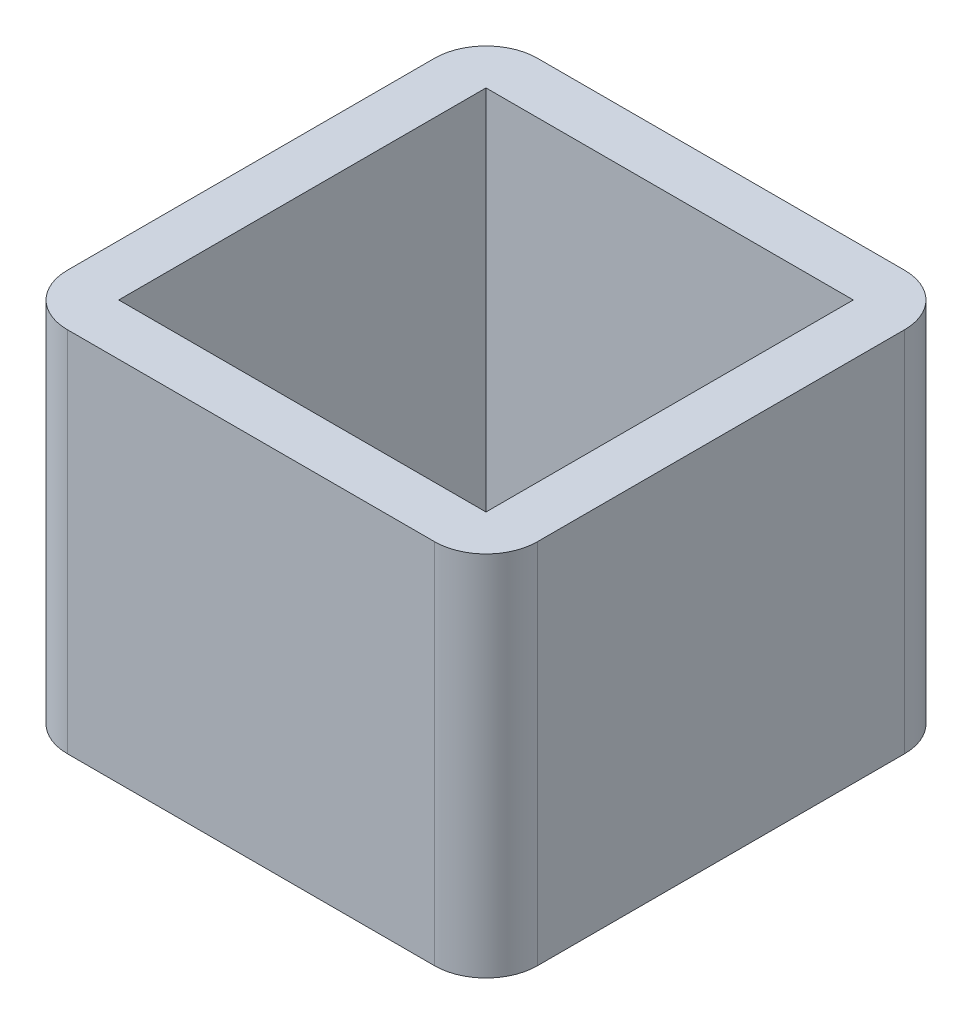
ISO-10303-21;
HEADER;
FILE_DESCRIPTION(('STEP AP214'),'2;1');
FILE_NAME('part.step','',(''),(''),'','','');
FILE_SCHEMA(('AUTOMOTIVE_DESIGN { 1 0 10303 214 1 1 1 1 }'));
ENDSEC;
DATA;
#1=APPLICATION_CONTEXT('core data for automotive mechanical design processes');
#2=APPLICATION_PROTOCOL_DEFINITION('international standard','automotive_design',2000,#1);
#3=PRODUCT_CONTEXT('',#1,'mechanical');
#4=PRODUCT('Part','Part','',(#3));
#5=PRODUCT_RELATED_PRODUCT_CATEGORY('part','',(#4));
#6=PRODUCT_DEFINITION_FORMATION('','',#4);
#7=PRODUCT_DEFINITION_CONTEXT('part definition',#1,'design');
#8=PRODUCT_DEFINITION('design','',#6,#7);
#9=PRODUCT_DEFINITION_SHAPE('','',#8);
#10=(LENGTH_UNIT() NAMED_UNIT(*) SI_UNIT(.MILLI.,.METRE.));
#11=(NAMED_UNIT(*) PLANE_ANGLE_UNIT() SI_UNIT($,.RADIAN.));
#12=(NAMED_UNIT(*) SI_UNIT($,.STERADIAN.) SOLID_ANGLE_UNIT());
#13=UNCERTAINTY_MEASURE_WITH_UNIT(LENGTH_MEASURE(1.E-05),#10,'distance_accuracy_value','');
#14=(GEOMETRIC_REPRESENTATION_CONTEXT(3) GLOBAL_UNCERTAINTY_ASSIGNED_CONTEXT((#13)) GLOBAL_UNIT_ASSIGNED_CONTEXT((#10,
#11,#12)) REPRESENTATION_CONTEXT('',''));
#15=CARTESIAN_POINT('',(0.,0.,0.));
#16=DIRECTION('',(0.,0.,1.));
#17=DIRECTION('',(1.,0.,0.));
#18=AXIS2_PLACEMENT_3D('',#15,#16,#17);
#19=CARTESIAN_POINT('',(22.8,20.,2.8));
#20=DIRECTION('',(0.,-1.,0.));
#21=DIRECTION('',(0.,0.,-1.));
#22=AXIS2_PLACEMENT_3D('',#19,#20,#21);
#23=CYLINDRICAL_SURFACE('',#22,2.8);
#24=CARTESIAN_POINT('',(22.8,0.,2.8));
#25=DIRECTION('',(0.,1.,0.));
#26=DIRECTION('',(0.,0.,-1.));
#27=AXIS2_PLACEMENT_3D('',#24,#25,#26);
#28=CIRCLE('',#27,2.8);
#29=CARTESIAN_POINT('',(25.6,0.,2.80000000000002));
#30=VERTEX_POINT('',#29);
#31=CARTESIAN_POINT('',(22.8,0.,0.));
#32=VERTEX_POINT('',#31);
#33=EDGE_CURVE('E157',#30,#32,#28,.T.);
#34=ORIENTED_EDGE('',*,*,#33,.T.);
#35=DIRECTION('',(0.,-1.,0.));
#36=VECTOR('',#35,1.);
#37=CARTESIAN_POINT('',(22.8,20.,0.));
#38=LINE('',#37,#36);
#39=CARTESIAN_POINT('',(22.8,20.,0.));
#40=VERTEX_POINT('',#39);
#41=EDGE_CURVE('E11',#40,#32,#38,.T.);
#42=ORIENTED_EDGE('',*,*,#41,.F.);
#43=CARTESIAN_POINT('',(22.8,20.,2.8));
#44=DIRECTION('',(0.,1.,0.));
#45=DIRECTION('',(0.,0.,-1.));
#46=AXIS2_PLACEMENT_3D('',#43,#44,#45);
#47=CIRCLE('',#46,2.8);
#48=CARTESIAN_POINT('',(25.6,20.,2.80000000000002));
#49=VERTEX_POINT('',#48);
#50=EDGE_CURVE('E158',#49,#40,#47,.T.);
#51=ORIENTED_EDGE('',*,*,#50,.F.);
#52=DIRECTION('',(0.,-1.,0.));
#53=VECTOR('',#52,1.);
#54=CARTESIAN_POINT('',(25.6,20.,2.80000000000002));
#55=LINE('',#54,#53);
#56=EDGE_CURVE('E176',#49,#30,#55,.T.);
#57=ORIENTED_EDGE('',*,*,#56,.T.);
#58=EDGE_LOOP('',(#34,#42,#51,#57));
#59=FACE_BOUND('',#58,.T.);
#60=ADVANCED_FACE('F32',(#59),#23,.T.);
#61=CARTESIAN_POINT('',(2.80000000000002,20.,0.));
#62=DIRECTION('',(0.,0.,1.));
#63=DIRECTION('',(1.,0.,0.));
#64=AXIS2_PLACEMENT_3D('',#61,#62,#63);
#65=PLANE('',#64);
#66=DIRECTION('',(-1.,0.,0.));
#67=VECTOR('',#66,1.);
#68=CARTESIAN_POINT('',(2.80000000000002,0.,0.));
#69=LINE('',#68,#67);
#70=CARTESIAN_POINT('',(2.80000000000002,0.,0.));
#71=VERTEX_POINT('',#70);
#72=EDGE_CURVE('E179',#32,#71,#69,.T.);
#73=ORIENTED_EDGE('',*,*,#72,.T.);
#74=DIRECTION('',(0.,-1.,0.));
#75=VECTOR('',#74,1.);
#76=CARTESIAN_POINT('',(2.80000000000002,20.,0.));
#77=LINE('',#76,#75);
#78=CARTESIAN_POINT('',(2.80000000000002,20.,0.));
#79=VERTEX_POINT('',#78);
#80=EDGE_CURVE('E39',#79,#71,#77,.T.);
#81=ORIENTED_EDGE('',*,*,#80,.F.);
#82=DIRECTION('',(-1.,0.,0.));
#83=VECTOR('',#82,1.);
#84=CARTESIAN_POINT('',(2.80000000000002,20.,0.));
#85=LINE('',#84,#83);
#86=EDGE_CURVE('E161',#40,#79,#85,.T.);
#87=ORIENTED_EDGE('',*,*,#86,.F.);
#88=ORIENTED_EDGE('',*,*,#41,.T.);
#89=EDGE_LOOP('',(#73,#81,#87,#88));
#90=FACE_BOUND('',#89,.T.);
#91=ADVANCED_FACE('F234',(#90),#65,.F.);
#92=CARTESIAN_POINT('',(2.8,20.,2.8));
#93=DIRECTION('',(0.,-1.,0.));
#94=DIRECTION('',(0.,0.,-1.));
#95=AXIS2_PLACEMENT_3D('',#92,#93,#94);
#96=CYLINDRICAL_SURFACE('',#95,2.8);
#97=CARTESIAN_POINT('',(2.8,0.,2.8));
#98=DIRECTION('',(0.,1.,0.));
#99=DIRECTION('',(0.,0.,1.));
#100=AXIS2_PLACEMENT_3D('',#97,#98,#99);
#101=CIRCLE('',#100,2.8);
#102=CARTESIAN_POINT('',(0.,0.,2.80000000000002));
#103=VERTEX_POINT('',#102);
#104=EDGE_CURVE('E181',#71,#103,#101,.T.);
#105=ORIENTED_EDGE('',*,*,#104,.T.);
#106=DIRECTION('',(0.,-1.,0.));
#107=VECTOR('',#106,1.);
#108=CARTESIAN_POINT('',(0.,20.,2.80000000000002));
#109=LINE('',#108,#107);
#110=CARTESIAN_POINT('',(0.,20.,2.80000000000002));
#111=VERTEX_POINT('',#110);
#112=EDGE_CURVE('E206',#111,#103,#109,.T.);
#113=ORIENTED_EDGE('',*,*,#112,.F.);
#114=CARTESIAN_POINT('',(2.8,20.,2.8));
#115=DIRECTION('',(0.,1.,0.));
#116=DIRECTION('',(0.,0.,1.));
#117=AXIS2_PLACEMENT_3D('',#114,#115,#116);
#118=CIRCLE('',#117,2.8);
#119=EDGE_CURVE('E164',#79,#111,#118,.T.);
#120=ORIENTED_EDGE('',*,*,#119,.F.);
#121=ORIENTED_EDGE('',*,*,#80,.T.);
#122=EDGE_LOOP('',(#105,#113,#120,#121));
#123=FACE_BOUND('',#122,.T.);
#124=ADVANCED_FACE('F213',(#123),#96,.T.);
#125=CARTESIAN_POINT('',(0.,20.,2.80000000000002));
#126=DIRECTION('',(1.,0.,0.));
#127=DIRECTION('',(0.,0.,-1.));
#128=AXIS2_PLACEMENT_3D('',#125,#126,#127);
#129=PLANE('',#128);
#130=DIRECTION('',(0.,0.,1.));
#131=VECTOR('',#130,1.);
#132=CARTESIAN_POINT('',(0.,0.,2.80000000000002));
#133=LINE('',#132,#131);
#134=CARTESIAN_POINT('',(0.,0.,22.8));
#135=VERTEX_POINT('',#134);
#136=EDGE_CURVE('E183',#103,#135,#133,.T.);
#137=ORIENTED_EDGE('',*,*,#136,.T.);
#138=DIRECTION('',(0.,-1.,0.));
#139=VECTOR('',#138,1.);
#140=CARTESIAN_POINT('',(0.,20.,22.8));
#141=LINE('',#140,#139);
#142=CARTESIAN_POINT('',(0.,20.,22.8));
#143=VERTEX_POINT('',#142);
#144=EDGE_CURVE('E203',#143,#135,#141,.T.);
#145=ORIENTED_EDGE('',*,*,#144,.F.);
#146=DIRECTION('',(0.,0.,1.));
#147=VECTOR('',#146,1.);
#148=CARTESIAN_POINT('',(0.,20.,2.80000000000002));
#149=LINE('',#148,#147);
#150=EDGE_CURVE('E166',#111,#143,#149,.T.);
#151=ORIENTED_EDGE('',*,*,#150,.F.);
#152=ORIENTED_EDGE('',*,*,#112,.T.);
#153=EDGE_LOOP('',(#137,#145,#151,#152));
#154=FACE_BOUND('',#153,.T.);
#155=ADVANCED_FACE('F222',(#154),#129,.F.);
#156=CARTESIAN_POINT('',(2.8,20.,22.8));
#157=DIRECTION('',(0.,-1.,0.));
#158=DIRECTION('',(0.,0.,-1.));
#159=AXIS2_PLACEMENT_3D('',#156,#157,#158);
#160=CYLINDRICAL_SURFACE('',#159,2.8);
#161=CARTESIAN_POINT('',(2.8,0.,22.8));
#162=DIRECTION('',(0.,1.,0.));
#163=DIRECTION('',(0.,0.,1.));
#164=AXIS2_PLACEMENT_3D('',#161,#162,#163);
#165=CIRCLE('',#164,2.8);
#166=CARTESIAN_POINT('',(2.80000000000002,0.,25.6));
#167=VERTEX_POINT('',#166);
#168=EDGE_CURVE('E185',#135,#167,#165,.T.);
#169=ORIENTED_EDGE('',*,*,#168,.T.);
#170=DIRECTION('',(0.,-1.,0.));
#171=VECTOR('',#170,1.);
#172=CARTESIAN_POINT('',(2.80000000000002,20.,25.6));
#173=LINE('',#172,#171);
#174=CARTESIAN_POINT('',(2.80000000000002,20.,25.6));
#175=VERTEX_POINT('',#174);
#176=EDGE_CURVE('E200',#175,#167,#173,.T.);
#177=ORIENTED_EDGE('',*,*,#176,.F.);
#178=CARTESIAN_POINT('',(2.8,20.,22.8));
#179=DIRECTION('',(0.,1.,0.));
#180=DIRECTION('',(0.,0.,1.));
#181=AXIS2_PLACEMENT_3D('',#178,#179,#180);
#182=CIRCLE('',#181,2.8);
#183=EDGE_CURVE('E168',#143,#175,#182,.T.);
#184=ORIENTED_EDGE('',*,*,#183,.F.);
#185=ORIENTED_EDGE('',*,*,#144,.T.);
#186=EDGE_LOOP('',(#169,#177,#184,#185));
#187=FACE_BOUND('',#186,.T.);
#188=ADVANCED_FACE('F226',(#187),#160,.T.);
#189=CARTESIAN_POINT('',(2.80000000000002,20.,25.6));
#190=DIRECTION('',(0.,0.,-1.));
#191=DIRECTION('',(-1.,0.,0.));
#192=AXIS2_PLACEMENT_3D('',#189,#190,#191);
#193=PLANE('',#192);
#194=DIRECTION('',(1.,0.,0.));
#195=VECTOR('',#194,1.);
#196=CARTESIAN_POINT('',(2.80000000000002,0.,25.6));
#197=LINE('',#196,#195);
#198=CARTESIAN_POINT('',(22.8,0.,25.6));
#199=VERTEX_POINT('',#198);
#200=EDGE_CURVE('E187',#167,#199,#197,.T.);
#201=ORIENTED_EDGE('',*,*,#200,.T.);
#202=DIRECTION('',(0.,-1.,0.));
#203=VECTOR('',#202,1.);
#204=CARTESIAN_POINT('',(22.8,20.,25.6));
#205=LINE('',#204,#203);
#206=CARTESIAN_POINT('',(22.8,20.,25.6));
#207=VERTEX_POINT('',#206);
#208=EDGE_CURVE('E197',#207,#199,#205,.T.);
#209=ORIENTED_EDGE('',*,*,#208,.F.);
#210=DIRECTION('',(1.,0.,0.));
#211=VECTOR('',#210,1.);
#212=CARTESIAN_POINT('',(2.80000000000002,20.,25.6));
#213=LINE('',#212,#211);
#214=EDGE_CURVE('E170',#175,#207,#213,.T.);
#215=ORIENTED_EDGE('',*,*,#214,.F.);
#216=ORIENTED_EDGE('',*,*,#176,.T.);
#217=EDGE_LOOP('',(#201,#209,#215,#216));
#218=FACE_BOUND('',#217,.T.);
#219=ADVANCED_FACE('F247',(#218),#193,.F.);
#220=CARTESIAN_POINT('',(22.8,20.,22.8));
#221=DIRECTION('',(0.,-1.,0.));
#222=DIRECTION('',(0.,0.,-1.));
#223=AXIS2_PLACEMENT_3D('',#220,#221,#222);
#224=CYLINDRICAL_SURFACE('',#223,2.8);
#225=CARTESIAN_POINT('',(22.8,0.,22.8));
#226=DIRECTION('',(0.,1.,0.));
#227=DIRECTION('',(0.,0.,1.));
#228=AXIS2_PLACEMENT_3D('',#225,#226,#227);
#229=CIRCLE('',#228,2.8);
#230=CARTESIAN_POINT('',(25.6,0.,22.8));
#231=VERTEX_POINT('',#230);
#232=EDGE_CURVE('E189',#199,#231,#229,.T.);
#233=ORIENTED_EDGE('',*,*,#232,.T.);
#234=DIRECTION('',(0.,-1.,0.));
#235=VECTOR('',#234,1.);
#236=CARTESIAN_POINT('',(25.6,20.,22.8));
#237=LINE('',#236,#235);
#238=CARTESIAN_POINT('',(25.6,20.,22.8));
#239=VERTEX_POINT('',#238);
#240=EDGE_CURVE('E194',#239,#231,#237,.T.);
#241=ORIENTED_EDGE('',*,*,#240,.F.);
#242=CARTESIAN_POINT('',(22.8,20.,22.8));
#243=DIRECTION('',(0.,1.,0.));
#244=DIRECTION('',(0.,0.,1.));
#245=AXIS2_PLACEMENT_3D('',#242,#243,#244);
#246=CIRCLE('',#245,2.8);
#247=EDGE_CURVE('E172',#207,#239,#246,.T.);
#248=ORIENTED_EDGE('',*,*,#247,.F.);
#249=ORIENTED_EDGE('',*,*,#208,.T.);
#250=EDGE_LOOP('',(#233,#241,#248,#249));
#251=FACE_BOUND('',#250,.T.);
#252=ADVANCED_FACE('F245',(#251),#224,.T.);
#253=CARTESIAN_POINT('',(25.6,20.,2.80000000000002));
#254=DIRECTION('',(-1.,0.,0.));
#255=DIRECTION('',(0.,0.,1.));
#256=AXIS2_PLACEMENT_3D('',#253,#254,#255);
#257=PLANE('',#256);
#258=DIRECTION('',(0.,0.,-1.));
#259=VECTOR('',#258,1.);
#260=CARTESIAN_POINT('',(25.6,0.,2.80000000000002));
#261=LINE('',#260,#259);
#262=EDGE_CURVE('E162',#231,#30,#261,.T.);
#263=ORIENTED_EDGE('',*,*,#262,.T.);
#264=ORIENTED_EDGE('',*,*,#56,.F.);
#265=DIRECTION('',(0.,0.,-1.));
#266=VECTOR('',#265,1.);
#267=CARTESIAN_POINT('',(25.6,20.,2.80000000000002));
#268=LINE('',#267,#266);
#269=EDGE_CURVE('E174',#239,#49,#268,.T.);
#270=ORIENTED_EDGE('',*,*,#269,.F.);
#271=ORIENTED_EDGE('',*,*,#240,.T.);
#272=EDGE_LOOP('',(#263,#264,#270,#271));
#273=FACE_BOUND('',#272,.T.);
#274=ADVANCED_FACE('F240',(#273),#257,.F.);
#275=CARTESIAN_POINT('',(22.8,20.,2.8));
#276=DIRECTION('',(0.,-1.,0.));
#277=DIRECTION('',(0.,0.,-1.));
#278=AXIS2_PLACEMENT_3D('',#275,#276,#277);
#279=PLANE('',#278);
#280=DIRECTION('',(1.,0.,0.));
#281=VECTOR('',#280,1.);
#282=CARTESIAN_POINT('',(22.8,20.,2.8));
#283=LINE('',#282,#281);
#284=CARTESIAN_POINT('',(2.8,20.,2.8));
#285=VERTEX_POINT('',#284);
#286=CARTESIAN_POINT('',(22.8,20.,2.8));
#287=VERTEX_POINT('',#286);
#288=EDGE_CURVE('E151',#285,#287,#283,.T.);
#289=ORIENTED_EDGE('',*,*,#288,.T.);
#290=DIRECTION('',(0.,0.,1.));
#291=VECTOR('',#290,1.);
#292=CARTESIAN_POINT('',(22.8,20.,2.8));
#293=LINE('',#292,#291);
#294=CARTESIAN_POINT('',(22.8,20.,22.8));
#295=VERTEX_POINT('',#294);
#296=EDGE_CURVE('E154',#287,#295,#293,.T.);
#297=ORIENTED_EDGE('',*,*,#296,.T.);
#298=DIRECTION('',(-1.,0.,0.));
#299=VECTOR('',#298,1.);
#300=CARTESIAN_POINT('',(22.8,20.,22.8));
#301=LINE('',#300,#299);
#302=CARTESIAN_POINT('',(2.8,20.,22.8));
#303=VERTEX_POINT('',#302);
#304=EDGE_CURVE('E146',#295,#303,#301,.T.);
#305=ORIENTED_EDGE('',*,*,#304,.T.);
#306=DIRECTION('',(0.,0.,-1.));
#307=VECTOR('',#306,1.);
#308=CARTESIAN_POINT('',(2.8,20.,2.79999999999999));
#309=LINE('',#308,#307);
#310=EDGE_CURVE('E126',#303,#285,#309,.T.);
#311=ORIENTED_EDGE('',*,*,#310,.T.);
#312=EDGE_LOOP('',(#289,#297,#305,#311));
#313=FACE_BOUND('',#312,.T.);
#314=ORIENTED_EDGE('',*,*,#50,.T.);
#315=ORIENTED_EDGE('',*,*,#86,.T.);
#316=ORIENTED_EDGE('',*,*,#119,.T.);
#317=ORIENTED_EDGE('',*,*,#150,.T.);
#318=ORIENTED_EDGE('',*,*,#183,.T.);
#319=ORIENTED_EDGE('',*,*,#214,.T.);
#320=ORIENTED_EDGE('',*,*,#247,.T.);
#321=ORIENTED_EDGE('',*,*,#269,.T.);
#322=EDGE_LOOP('',(#314,#315,#316,#317,#318,#319,#320,#321));
#323=FACE_BOUND('',#322,.T.);
#324=ADVANCED_FACE('F230',(#313,#323),#279,.F.);
#325=CARTESIAN_POINT('',(22.8,0.,2.8));
#326=DIRECTION('',(0.,-1.,0.));
#327=DIRECTION('',(0.,0.,-1.));
#328=AXIS2_PLACEMENT_3D('',#325,#326,#327);
#329=PLANE('',#328);
#330=DIRECTION('',(0.,0.,1.));
#331=VECTOR('',#330,1.);
#332=CARTESIAN_POINT('',(22.8,0.,2.8));
#333=LINE('',#332,#331);
#334=CARTESIAN_POINT('',(22.8,0.,2.8));
#335=VERTEX_POINT('',#334);
#336=CARTESIAN_POINT('',(22.8,0.,22.8));
#337=VERTEX_POINT('',#336);
#338=EDGE_CURVE('E54',#335,#337,#333,.T.);
#339=ORIENTED_EDGE('',*,*,#338,.F.);
#340=DIRECTION('',(1.,0.,0.));
#341=VECTOR('',#340,1.);
#342=CARTESIAN_POINT('',(2.8,0.,2.8));
#343=LINE('',#342,#341);
#344=CARTESIAN_POINT('',(2.8,0.,2.8));
#345=VERTEX_POINT('',#344);
#346=EDGE_CURVE('E139',#345,#335,#343,.T.);
#347=ORIENTED_EDGE('',*,*,#346,.F.);
#348=DIRECTION('',(0.,0.,-1.));
#349=VECTOR('',#348,1.);
#350=CARTESIAN_POINT('',(2.8,0.,2.8));
#351=LINE('',#350,#349);
#352=CARTESIAN_POINT('',(2.8,0.,22.8));
#353=VERTEX_POINT('',#352);
#354=EDGE_CURVE('E123',#353,#345,#351,.T.);
#355=ORIENTED_EDGE('',*,*,#354,.F.);
#356=DIRECTION('',(-1.,0.,0.));
#357=VECTOR('',#356,1.);
#358=CARTESIAN_POINT('',(2.8,0.,22.8));
#359=LINE('',#358,#357);
#360=EDGE_CURVE('E132',#337,#353,#359,.T.);
#361=ORIENTED_EDGE('',*,*,#360,.F.);
#362=EDGE_LOOP('',(#339,#347,#355,#361));
#363=FACE_BOUND('',#362,.T.);
#364=ORIENTED_EDGE('',*,*,#33,.F.);
#365=ORIENTED_EDGE('',*,*,#262,.F.);
#366=ORIENTED_EDGE('',*,*,#232,.F.);
#367=ORIENTED_EDGE('',*,*,#200,.F.);
#368=ORIENTED_EDGE('',*,*,#168,.F.);
#369=ORIENTED_EDGE('',*,*,#136,.F.);
#370=ORIENTED_EDGE('',*,*,#104,.F.);
#371=ORIENTED_EDGE('',*,*,#72,.F.);
#372=EDGE_LOOP('',(#364,#365,#366,#367,#368,#369,#370,#371));
#373=FACE_BOUND('',#372,.T.);
#374=ADVANCED_FACE('F136',(#363,#373),#329,.T.);
#375=CARTESIAN_POINT('',(22.8,1040.5,2.8));
#376=DIRECTION('',(1.,0.,0.));
#377=DIRECTION('',(0.,0.,-1.));
#378=AXIS2_PLACEMENT_3D('',#375,#376,#377);
#379=PLANE('',#378);
#380=DIRECTION('',(0.,-1.,0.));
#381=VECTOR('',#380,1.);
#382=CARTESIAN_POINT('',(22.8,1040.5,2.8));
#383=LINE('',#382,#381);
#384=EDGE_CURVE('E144',#287,#335,#383,.T.);
#385=ORIENTED_EDGE('',*,*,#384,.T.);
#386=ORIENTED_EDGE('',*,*,#338,.T.);
#387=DIRECTION('',(0.,-1.,0.));
#388=VECTOR('',#387,1.);
#389=CARTESIAN_POINT('',(22.8,1040.5,22.8));
#390=LINE('',#389,#388);
#391=EDGE_CURVE('E129',#295,#337,#390,.T.);
#392=ORIENTED_EDGE('',*,*,#391,.F.);
#393=ORIENTED_EDGE('',*,*,#296,.F.);
#394=EDGE_LOOP('',(#385,#386,#392,#393));
#395=FACE_BOUND('',#394,.T.);
#396=ADVANCED_FACE('F310',(#395),#379,.F.);
#397=CARTESIAN_POINT('',(2.8,1040.5,2.8));
#398=DIRECTION('',(0.,0.,-1.));
#399=DIRECTION('',(-1.,0.,0.));
#400=AXIS2_PLACEMENT_3D('',#397,#398,#399);
#401=PLANE('',#400);
#402=DIRECTION('',(0.,-1.,0.));
#403=VECTOR('',#402,1.);
#404=CARTESIAN_POINT('',(2.8,1040.5,2.8));
#405=LINE('',#404,#403);
#406=EDGE_CURVE('E128',#285,#345,#405,.T.);
#407=ORIENTED_EDGE('',*,*,#406,.T.);
#408=ORIENTED_EDGE('',*,*,#346,.T.);
#409=ORIENTED_EDGE('',*,*,#384,.F.);
#410=ORIENTED_EDGE('',*,*,#288,.F.);
#411=EDGE_LOOP('',(#407,#408,#409,#410));
#412=FACE_BOUND('',#411,.T.);
#413=ADVANCED_FACE('F319',(#412),#401,.F.);
#414=CARTESIAN_POINT('',(2.8,1040.5,2.8));
#415=DIRECTION('',(-1.,0.,0.));
#416=DIRECTION('',(0.,0.,1.));
#417=AXIS2_PLACEMENT_3D('',#414,#415,#416);
#418=PLANE('',#417);
#419=DIRECTION('',(0.,-1.,0.));
#420=VECTOR('',#419,1.);
#421=CARTESIAN_POINT('',(2.8,1040.5,22.8));
#422=LINE('',#421,#420);
#423=EDGE_CURVE('E46',#303,#353,#422,.T.);
#424=ORIENTED_EDGE('',*,*,#423,.T.);
#425=ORIENTED_EDGE('',*,*,#354,.T.);
#426=ORIENTED_EDGE('',*,*,#406,.F.);
#427=ORIENTED_EDGE('',*,*,#310,.F.);
#428=EDGE_LOOP('',(#424,#425,#426,#427));
#429=FACE_BOUND('',#428,.T.);
#430=ADVANCED_FACE('F120',(#429),#418,.F.);
#431=CARTESIAN_POINT('',(2.8,1040.5,22.8));
#432=DIRECTION('',(0.,0.,1.));
#433=DIRECTION('',(1.,0.,0.));
#434=AXIS2_PLACEMENT_3D('',#431,#432,#433);
#435=PLANE('',#434);
#436=ORIENTED_EDGE('',*,*,#391,.T.);
#437=ORIENTED_EDGE('',*,*,#360,.T.);
#438=ORIENTED_EDGE('',*,*,#423,.F.);
#439=ORIENTED_EDGE('',*,*,#304,.F.);
#440=EDGE_LOOP('',(#436,#437,#438,#439));
#441=FACE_BOUND('',#440,.T.);
#442=ADVANCED_FACE('F133',(#441),#435,.F.);
#443=CLOSED_SHELL('',(#60,#91,#124,#155,#188,#219,#252,#274,#324,#374,#396,#413,#430,#442));
#444=MANIFOLD_SOLID_BREP('B2',#443);
#445=ADVANCED_BREP_SHAPE_REPRESENTATION('',(#18,#444),#14);
#446=SHAPE_DEFINITION_REPRESENTATION(#9,#445);
ENDSEC;
END-ISO-10303-21;
